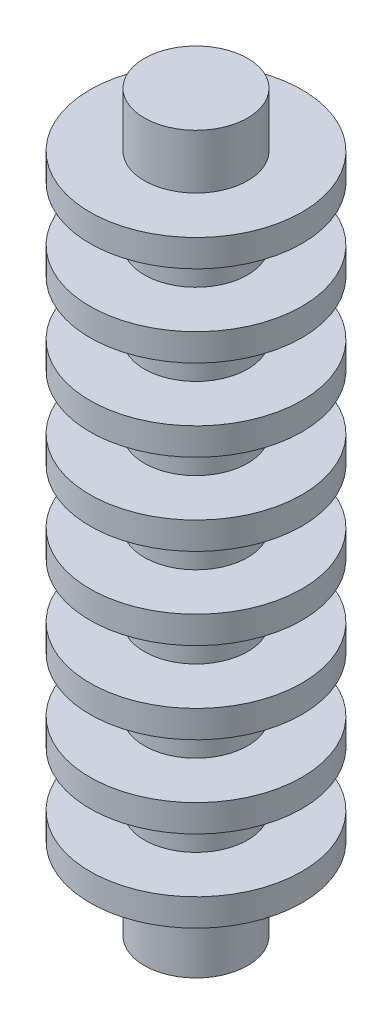
ISO-10303-21;
HEADER;
FILE_DESCRIPTION(('STEP AP214'),'2;1');
FILE_NAME('part.step','',(''),(''),'','','');
FILE_SCHEMA(('AUTOMOTIVE_DESIGN { 1 0 10303 214 1 1 1 1 }'));
ENDSEC;
DATA;
#1=APPLICATION_CONTEXT('core data for automotive mechanical design processes');
#2=APPLICATION_PROTOCOL_DEFINITION('international standard','automotive_design',2000,#1);
#3=PRODUCT_CONTEXT('',#1,'mechanical');
#4=PRODUCT('Part','Part','',(#3));
#5=PRODUCT_RELATED_PRODUCT_CATEGORY('part','',(#4));
#6=PRODUCT_DEFINITION_FORMATION('','',#4);
#7=PRODUCT_DEFINITION_CONTEXT('part definition',#1,'design');
#8=PRODUCT_DEFINITION('design','',#6,#7);
#9=PRODUCT_DEFINITION_SHAPE('','',#8);
#10=(LENGTH_UNIT() NAMED_UNIT(*) SI_UNIT(.MILLI.,.METRE.));
#11=(NAMED_UNIT(*) PLANE_ANGLE_UNIT() SI_UNIT($,.RADIAN.));
#12=(NAMED_UNIT(*) SI_UNIT($,.STERADIAN.) SOLID_ANGLE_UNIT());
#13=UNCERTAINTY_MEASURE_WITH_UNIT(LENGTH_MEASURE(1.E-05),#10,'distance_accuracy_value','');
#14=(GEOMETRIC_REPRESENTATION_CONTEXT(3) GLOBAL_UNCERTAINTY_ASSIGNED_CONTEXT((#13)) GLOBAL_UNIT_ASSIGNED_CONTEXT((#10,
#11,#12)) REPRESENTATION_CONTEXT('',''));
#15=CARTESIAN_POINT('',(0.,0.,0.));
#16=DIRECTION('',(0.,0.,1.));
#17=DIRECTION('',(1.,0.,0.));
#18=AXIS2_PLACEMENT_3D('',#15,#16,#17);
#19=CARTESIAN_POINT('',(3.8,27.,0.));
#20=DIRECTION('',(0.,-1.,0.));
#21=DIRECTION('',(1.,0.,0.));
#22=AXIS2_PLACEMENT_3D('',#19,#20,#21);
#23=PLANE('',#22);
#24=CARTESIAN_POINT('',(0.,27.,0.));
#25=DIRECTION('',(0.,1.,0.));
#26=DIRECTION('',(-1.,0.,0.));
#27=AXIS2_PLACEMENT_3D('',#24,#25,#26);
#28=CIRCLE('',#27,3.79999999999999);
#29=CARTESIAN_POINT('',(-3.79999999999998,27.,0.));
#30=VERTEX_POINT('',#29);
#31=EDGE_CURVE('E10',#30,#30,#28,.T.);
#32=ORIENTED_EDGE('',*,*,#31,.T.);
#33=EDGE_LOOP('',(#32));
#34=FACE_BOUND('',#33,.T.);
#35=ADVANCED_FACE('F40',(#34),#23,.F.);
#36=CARTESIAN_POINT('',(0.,27.,0.));
#37=DIRECTION('',(0.,1.,0.));
#38=DIRECTION('',(-1.,0.,0.));
#39=AXIS2_PLACEMENT_3D('',#36,#37,#38);
#40=CYLINDRICAL_SURFACE('',#39,3.79999999999999);
#41=ORIENTED_EDGE('',*,*,#31,.F.);
#42=EDGE_LOOP('',(#41));
#43=FACE_BOUND('',#42,.T.);
#44=CARTESIAN_POINT('',(0.,23.,0.));
#45=DIRECTION('',(0.,1.,0.));
#46=DIRECTION('',(-1.,0.,0.));
#47=AXIS2_PLACEMENT_3D('',#44,#45,#46);
#48=CIRCLE('',#47,3.79999999999999);
#49=CARTESIAN_POINT('',(-3.79999999999998,23.,0.));
#50=VERTEX_POINT('',#49);
#51=EDGE_CURVE('E46',#50,#50,#48,.T.);
#52=ORIENTED_EDGE('',*,*,#51,.T.);
#53=EDGE_LOOP('',(#52));
#54=FACE_BOUND('',#53,.T.);
#55=ADVANCED_FACE('F162',(#43,#54),#40,.T.);
#56=CARTESIAN_POINT('',(3.8,23.,0.));
#57=DIRECTION('',(0.,-1.,0.));
#58=DIRECTION('',(1.,0.,0.));
#59=AXIS2_PLACEMENT_3D('',#56,#57,#58);
#60=PLANE('',#59);
#61=ORIENTED_EDGE('',*,*,#51,.F.);
#62=EDGE_LOOP('',(#61));
#63=FACE_BOUND('',#62,.T.);
#64=CARTESIAN_POINT('',(0.,23.,0.));
#65=DIRECTION('',(0.,1.,0.));
#66=DIRECTION('',(-1.,0.,0.));
#67=AXIS2_PLACEMENT_3D('',#64,#65,#66);
#68=CIRCLE('',#67,7.8);
#69=CARTESIAN_POINT('',(-7.79999999999999,23.,0.));
#70=VERTEX_POINT('',#69);
#71=EDGE_CURVE('E50',#70,#70,#68,.T.);
#72=ORIENTED_EDGE('',*,*,#71,.T.);
#73=EDGE_LOOP('',(#72));
#74=FACE_BOUND('',#73,.T.);
#75=ADVANCED_FACE('F166',(#63,#74),#60,.F.);
#76=CARTESIAN_POINT('',(0.,27.,0.));
#77=DIRECTION('',(0.,1.,0.));
#78=DIRECTION('',(-1.,0.,0.));
#79=AXIS2_PLACEMENT_3D('',#76,#77,#78);
#80=CYLINDRICAL_SURFACE('',#79,7.79999999999999);
#81=ORIENTED_EDGE('',*,*,#71,.F.);
#82=EDGE_LOOP('',(#81));
#83=FACE_BOUND('',#82,.T.);
#84=CARTESIAN_POINT('',(0.,21.,0.));
#85=DIRECTION('',(0.,1.,0.));
#86=DIRECTION('',(-1.,0.,0.));
#87=AXIS2_PLACEMENT_3D('',#84,#85,#86);
#88=CIRCLE('',#87,7.79999999999999);
#89=CARTESIAN_POINT('',(-7.79999999999998,21.,0.));
#90=VERTEX_POINT('',#89);
#91=EDGE_CURVE('E54',#90,#90,#88,.T.);
#92=ORIENTED_EDGE('',*,*,#91,.T.);
#93=EDGE_LOOP('',(#92));
#94=FACE_BOUND('',#93,.T.);
#95=ADVANCED_FACE('F171',(#83,#94),#80,.T.);
#96=CARTESIAN_POINT('',(7.8,21.,0.));
#97=DIRECTION('',(0.,1.,0.));
#98=DIRECTION('',(-1.,0.,0.));
#99=AXIS2_PLACEMENT_3D('',#96,#97,#98);
#100=PLANE('',#99);
#101=ORIENTED_EDGE('',*,*,#91,.F.);
#102=EDGE_LOOP('',(#101));
#103=FACE_BOUND('',#102,.T.);
#104=CARTESIAN_POINT('',(0.,21.,0.));
#105=DIRECTION('',(0.,1.,0.));
#106=DIRECTION('',(-1.,0.,0.));
#107=AXIS2_PLACEMENT_3D('',#104,#105,#106);
#108=CIRCLE('',#107,3.79999999999999);
#109=CARTESIAN_POINT('',(-3.79999999999998,21.,0.));
#110=VERTEX_POINT('',#109);
#111=EDGE_CURVE('E59',#110,#110,#108,.T.);
#112=ORIENTED_EDGE('',*,*,#111,.T.);
#113=EDGE_LOOP('',(#112));
#114=FACE_BOUND('',#113,.T.);
#115=ADVANCED_FACE('F177',(#103,#114),#100,.F.);
#116=CARTESIAN_POINT('',(0.,27.,0.));
#117=DIRECTION('',(0.,1.,0.));
#118=DIRECTION('',(-1.,0.,0.));
#119=AXIS2_PLACEMENT_3D('',#116,#117,#118);
#120=CYLINDRICAL_SURFACE('',#119,3.79999999999981);
#121=ORIENTED_EDGE('',*,*,#111,.F.);
#122=EDGE_LOOP('',(#121));
#123=FACE_BOUND('',#122,.T.);
#124=CARTESIAN_POINT('',(0.,17.,0.));
#125=DIRECTION('',(0.,1.,0.));
#126=DIRECTION('',(-1.,0.,0.));
#127=AXIS2_PLACEMENT_3D('',#124,#125,#126);
#128=CIRCLE('',#127,3.80000000000005);
#129=CARTESIAN_POINT('',(-3.80000000000005,17.,0.));
#130=VERTEX_POINT('',#129);
#131=EDGE_CURVE('E62',#130,#130,#128,.T.);
#132=ORIENTED_EDGE('',*,*,#131,.T.);
#133=EDGE_LOOP('',(#132));
#134=FACE_BOUND('',#133,.T.);
#135=ADVANCED_FACE('F181',(#123,#134),#120,.T.);
#136=CARTESIAN_POINT('',(3.80000000000006,17.,0.));
#137=DIRECTION('',(0.,-1.,0.));
#138=DIRECTION('',(1.,0.,0.));
#139=AXIS2_PLACEMENT_3D('',#136,#137,#138);
#140=PLANE('',#139);
#141=ORIENTED_EDGE('',*,*,#131,.F.);
#142=EDGE_LOOP('',(#141));
#143=FACE_BOUND('',#142,.T.);
#144=CARTESIAN_POINT('',(0.,17.,0.));
#145=DIRECTION('',(0.,1.,0.));
#146=DIRECTION('',(-1.,0.,0.));
#147=AXIS2_PLACEMENT_3D('',#144,#145,#146);
#148=CIRCLE('',#147,7.80000000000006);
#149=CARTESIAN_POINT('',(-7.80000000000005,17.,0.));
#150=VERTEX_POINT('',#149);
#151=EDGE_CURVE('E65',#150,#150,#148,.T.);
#152=ORIENTED_EDGE('',*,*,#151,.T.);
#153=EDGE_LOOP('',(#152));
#154=FACE_BOUND('',#153,.T.);
#155=ADVANCED_FACE('F185',(#143,#154),#140,.F.);
#156=CARTESIAN_POINT('',(0.,27.,0.));
#157=DIRECTION('',(0.,1.,0.));
#158=DIRECTION('',(-1.,0.,0.));
#159=AXIS2_PLACEMENT_3D('',#156,#157,#158);
#160=CYLINDRICAL_SURFACE('',#159,7.80000000000006);
#161=ORIENTED_EDGE('',*,*,#151,.F.);
#162=EDGE_LOOP('',(#161));
#163=FACE_BOUND('',#162,.T.);
#164=CARTESIAN_POINT('',(0.,15.,0.));
#165=DIRECTION('',(0.,1.,0.));
#166=DIRECTION('',(-1.,0.,0.));
#167=AXIS2_PLACEMENT_3D('',#164,#165,#166);
#168=CIRCLE('',#167,7.80000000000006);
#169=CARTESIAN_POINT('',(-7.80000000000005,15.,0.));
#170=VERTEX_POINT('',#169);
#171=EDGE_CURVE('E68',#170,#170,#168,.T.);
#172=ORIENTED_EDGE('',*,*,#171,.T.);
#173=EDGE_LOOP('',(#172));
#174=FACE_BOUND('',#173,.T.);
#175=ADVANCED_FACE('F189',(#163,#174),#160,.T.);
#176=CARTESIAN_POINT('',(7.80000000000007,15.,0.));
#177=DIRECTION('',(0.,1.,0.));
#178=DIRECTION('',(-1.,0.,0.));
#179=AXIS2_PLACEMENT_3D('',#176,#177,#178);
#180=PLANE('',#179);
#181=ORIENTED_EDGE('',*,*,#171,.F.);
#182=EDGE_LOOP('',(#181));
#183=FACE_BOUND('',#182,.T.);
#184=CARTESIAN_POINT('',(0.,15.,0.));
#185=DIRECTION('',(0.,1.,0.));
#186=DIRECTION('',(-1.,0.,0.));
#187=AXIS2_PLACEMENT_3D('',#184,#185,#186);
#188=CIRCLE('',#187,3.80000000000005);
#189=CARTESIAN_POINT('',(-3.80000000000005,15.,0.));
#190=VERTEX_POINT('',#189);
#191=EDGE_CURVE('E71',#190,#190,#188,.T.);
#192=ORIENTED_EDGE('',*,*,#191,.T.);
#193=EDGE_LOOP('',(#192));
#194=FACE_BOUND('',#193,.T.);
#195=ADVANCED_FACE('F193',(#183,#194),#180,.F.);
#196=CARTESIAN_POINT('',(0.,27.,0.));
#197=DIRECTION('',(0.,1.,0.));
#198=DIRECTION('',(-1.,0.,0.));
#199=AXIS2_PLACEMENT_3D('',#196,#197,#198);
#200=CYLINDRICAL_SURFACE('',#199,3.80000000000012);
#201=ORIENTED_EDGE('',*,*,#191,.F.);
#202=EDGE_LOOP('',(#201));
#203=FACE_BOUND('',#202,.T.);
#204=CARTESIAN_POINT('',(0.,11.,0.));
#205=DIRECTION('',(0.,1.,0.));
#206=DIRECTION('',(-1.,0.,0.));
#207=AXIS2_PLACEMENT_3D('',#204,#205,#206);
#208=CIRCLE('',#207,3.80000000000012);
#209=CARTESIAN_POINT('',(-3.80000000000011,11.,0.));
#210=VERTEX_POINT('',#209);
#211=EDGE_CURVE('E74',#210,#210,#208,.T.);
#212=ORIENTED_EDGE('',*,*,#211,.T.);
#213=EDGE_LOOP('',(#212));
#214=FACE_BOUND('',#213,.T.);
#215=ADVANCED_FACE('F197',(#203,#214),#200,.T.);
#216=CARTESIAN_POINT('',(3.80000000000013,11.,0.));
#217=DIRECTION('',(0.,-1.,0.));
#218=DIRECTION('',(1.,0.,0.));
#219=AXIS2_PLACEMENT_3D('',#216,#217,#218);
#220=PLANE('',#219);
#221=ORIENTED_EDGE('',*,*,#211,.F.);
#222=EDGE_LOOP('',(#221));
#223=FACE_BOUND('',#222,.T.);
#224=CARTESIAN_POINT('',(0.,11.,0.));
#225=DIRECTION('',(0.,1.,0.));
#226=DIRECTION('',(-1.,0.,0.));
#227=AXIS2_PLACEMENT_3D('',#224,#225,#226);
#228=CIRCLE('',#227,7.80000000000012);
#229=CARTESIAN_POINT('',(-7.80000000000011,11.,0.));
#230=VERTEX_POINT('',#229);
#231=EDGE_CURVE('E77',#230,#230,#228,.T.);
#232=ORIENTED_EDGE('',*,*,#231,.T.);
#233=EDGE_LOOP('',(#232));
#234=FACE_BOUND('',#233,.T.);
#235=ADVANCED_FACE('F201',(#223,#234),#220,.F.);
#236=CARTESIAN_POINT('',(0.,27.,0.));
#237=DIRECTION('',(0.,1.,0.));
#238=DIRECTION('',(-1.,0.,0.));
#239=AXIS2_PLACEMENT_3D('',#236,#237,#238);
#240=CYLINDRICAL_SURFACE('',#239,7.80000000000012);
#241=ORIENTED_EDGE('',*,*,#231,.F.);
#242=EDGE_LOOP('',(#241));
#243=FACE_BOUND('',#242,.T.);
#244=CARTESIAN_POINT('',(0.,9.,0.));
#245=DIRECTION('',(0.,1.,0.));
#246=DIRECTION('',(-1.,0.,0.));
#247=AXIS2_PLACEMENT_3D('',#244,#245,#246);
#248=CIRCLE('',#247,7.80000000000012);
#249=CARTESIAN_POINT('',(-7.80000000000011,9.,0.));
#250=VERTEX_POINT('',#249);
#251=EDGE_CURVE('E80',#250,#250,#248,.T.);
#252=ORIENTED_EDGE('',*,*,#251,.T.);
#253=EDGE_LOOP('',(#252));
#254=FACE_BOUND('',#253,.T.);
#255=ADVANCED_FACE('F205',(#243,#254),#240,.T.);
#256=CARTESIAN_POINT('',(7.80000000000013,9.,0.));
#257=DIRECTION('',(0.,1.,0.));
#258=DIRECTION('',(-1.,0.,0.));
#259=AXIS2_PLACEMENT_3D('',#256,#257,#258);
#260=PLANE('',#259);
#261=ORIENTED_EDGE('',*,*,#251,.F.);
#262=EDGE_LOOP('',(#261));
#263=FACE_BOUND('',#262,.T.);
#264=CARTESIAN_POINT('',(0.,8.99999999999999,0.));
#265=DIRECTION('',(0.,1.,0.));
#266=DIRECTION('',(-1.,0.,0.));
#267=AXIS2_PLACEMENT_3D('',#264,#265,#266);
#268=CIRCLE('',#267,3.80000000000012);
#269=CARTESIAN_POINT('',(-3.80000000000011,8.99999999999999,0.));
#270=VERTEX_POINT('',#269);
#271=EDGE_CURVE('E83',#270,#270,#268,.T.);
#272=ORIENTED_EDGE('',*,*,#271,.T.);
#273=EDGE_LOOP('',(#272));
#274=FACE_BOUND('',#273,.T.);
#275=ADVANCED_FACE('F209',(#263,#274),#260,.F.);
#276=CARTESIAN_POINT('',(0.,27.,0.));
#277=DIRECTION('',(0.,1.,0.));
#278=DIRECTION('',(-1.,0.,0.));
#279=AXIS2_PLACEMENT_3D('',#276,#277,#278);
#280=CYLINDRICAL_SURFACE('',#279,3.80000000000018);
#281=ORIENTED_EDGE('',*,*,#271,.F.);
#282=EDGE_LOOP('',(#281));
#283=FACE_BOUND('',#282,.T.);
#284=CARTESIAN_POINT('',(0.,5.,0.));
#285=DIRECTION('',(0.,1.,0.));
#286=DIRECTION('',(-1.,0.,0.));
#287=AXIS2_PLACEMENT_3D('',#284,#285,#286);
#288=CIRCLE('',#287,3.80000000000018);
#289=CARTESIAN_POINT('',(-3.80000000000017,5.,0.));
#290=VERTEX_POINT('',#289);
#291=EDGE_CURVE('E86',#290,#290,#288,.T.);
#292=ORIENTED_EDGE('',*,*,#291,.T.);
#293=EDGE_LOOP('',(#292));
#294=FACE_BOUND('',#293,.T.);
#295=ADVANCED_FACE('F213',(#283,#294),#280,.T.);
#296=CARTESIAN_POINT('',(3.80000000000019,5.,0.));
#297=DIRECTION('',(0.,-1.,0.));
#298=DIRECTION('',(1.,0.,0.));
#299=AXIS2_PLACEMENT_3D('',#296,#297,#298);
#300=PLANE('',#299);
#301=ORIENTED_EDGE('',*,*,#291,.F.);
#302=EDGE_LOOP('',(#301));
#303=FACE_BOUND('',#302,.T.);
#304=CARTESIAN_POINT('',(0.,5.,0.));
#305=DIRECTION('',(0.,1.,0.));
#306=DIRECTION('',(-1.,0.,0.));
#307=AXIS2_PLACEMENT_3D('',#304,#305,#306);
#308=CIRCLE('',#307,7.80000000000018);
#309=CARTESIAN_POINT('',(-7.80000000000018,5.,0.));
#310=VERTEX_POINT('',#309);
#311=EDGE_CURVE('E89',#310,#310,#308,.T.);
#312=ORIENTED_EDGE('',*,*,#311,.T.);
#313=EDGE_LOOP('',(#312));
#314=FACE_BOUND('',#313,.T.);
#315=ADVANCED_FACE('F217',(#303,#314),#300,.F.);
#316=CARTESIAN_POINT('',(0.,27.,0.));
#317=DIRECTION('',(0.,1.,0.));
#318=DIRECTION('',(-1.,0.,0.));
#319=AXIS2_PLACEMENT_3D('',#316,#317,#318);
#320=CYLINDRICAL_SURFACE('',#319,7.80000000000018);
#321=ORIENTED_EDGE('',*,*,#311,.F.);
#322=EDGE_LOOP('',(#321));
#323=FACE_BOUND('',#322,.T.);
#324=CARTESIAN_POINT('',(0.,3.,0.));
#325=DIRECTION('',(0.,1.,0.));
#326=DIRECTION('',(-1.,0.,0.));
#327=AXIS2_PLACEMENT_3D('',#324,#325,#326);
#328=CIRCLE('',#327,7.80000000000018);
#329=CARTESIAN_POINT('',(-7.80000000000018,3.,0.));
#330=VERTEX_POINT('',#329);
#331=EDGE_CURVE('E92',#330,#330,#328,.T.);
#332=ORIENTED_EDGE('',*,*,#331,.T.);
#333=EDGE_LOOP('',(#332));
#334=FACE_BOUND('',#333,.T.);
#335=ADVANCED_FACE('F221',(#323,#334),#320,.T.);
#336=CARTESIAN_POINT('',(7.80000000000019,3.,0.));
#337=DIRECTION('',(0.,1.,0.));
#338=DIRECTION('',(-1.,0.,0.));
#339=AXIS2_PLACEMENT_3D('',#336,#337,#338);
#340=PLANE('',#339);
#341=ORIENTED_EDGE('',*,*,#331,.F.);
#342=EDGE_LOOP('',(#341));
#343=FACE_BOUND('',#342,.T.);
#344=CARTESIAN_POINT('',(0.,3.,0.));
#345=DIRECTION('',(0.,1.,0.));
#346=DIRECTION('',(-1.,0.,0.));
#347=AXIS2_PLACEMENT_3D('',#344,#345,#346);
#348=CIRCLE('',#347,3.80000000000018);
#349=CARTESIAN_POINT('',(-3.80000000000017,3.,0.));
#350=VERTEX_POINT('',#349);
#351=EDGE_CURVE('E95',#350,#350,#348,.T.);
#352=ORIENTED_EDGE('',*,*,#351,.T.);
#353=EDGE_LOOP('',(#352));
#354=FACE_BOUND('',#353,.T.);
#355=ADVANCED_FACE('F225',(#343,#354),#340,.F.);
#356=CARTESIAN_POINT('',(0.,27.,0.));
#357=DIRECTION('',(0.,1.,0.));
#358=DIRECTION('',(-1.,0.,0.));
#359=AXIS2_PLACEMENT_3D('',#356,#357,#358);
#360=CYLINDRICAL_SURFACE('',#359,3.80000000000024);
#361=ORIENTED_EDGE('',*,*,#351,.F.);
#362=EDGE_LOOP('',(#361));
#363=FACE_BOUND('',#362,.T.);
#364=CARTESIAN_POINT('',(0.,-1.,0.));
#365=DIRECTION('',(0.,1.,0.));
#366=DIRECTION('',(-1.,0.,0.));
#367=AXIS2_PLACEMENT_3D('',#364,#365,#366);
#368=CIRCLE('',#367,3.80000000000024);
#369=CARTESIAN_POINT('',(-3.80000000000024,-1.,0.));
#370=VERTEX_POINT('',#369);
#371=EDGE_CURVE('E98',#370,#370,#368,.T.);
#372=ORIENTED_EDGE('',*,*,#371,.T.);
#373=EDGE_LOOP('',(#372));
#374=FACE_BOUND('',#373,.T.);
#375=ADVANCED_FACE('F229',(#363,#374),#360,.T.);
#376=CARTESIAN_POINT('',(3.80000000000025,-1.,0.));
#377=DIRECTION('',(0.,-1.,0.));
#378=DIRECTION('',(1.,0.,0.));
#379=AXIS2_PLACEMENT_3D('',#376,#377,#378);
#380=PLANE('',#379);
#381=ORIENTED_EDGE('',*,*,#371,.F.);
#382=EDGE_LOOP('',(#381));
#383=FACE_BOUND('',#382,.T.);
#384=CARTESIAN_POINT('',(0.,-1.,0.));
#385=DIRECTION('',(0.,1.,0.));
#386=DIRECTION('',(-1.,0.,0.));
#387=AXIS2_PLACEMENT_3D('',#384,#385,#386);
#388=CIRCLE('',#387,7.80000000000025);
#389=CARTESIAN_POINT('',(-7.80000000000024,-1.,0.));
#390=VERTEX_POINT('',#389);
#391=EDGE_CURVE('E101',#390,#390,#388,.T.);
#392=ORIENTED_EDGE('',*,*,#391,.T.);
#393=EDGE_LOOP('',(#392));
#394=FACE_BOUND('',#393,.T.);
#395=ADVANCED_FACE('F233',(#383,#394),#380,.F.);
#396=CARTESIAN_POINT('',(0.,27.,0.));
#397=DIRECTION('',(0.,1.,0.));
#398=DIRECTION('',(-1.,0.,0.));
#399=AXIS2_PLACEMENT_3D('',#396,#397,#398);
#400=CYLINDRICAL_SURFACE('',#399,7.80000000000025);
#401=ORIENTED_EDGE('',*,*,#391,.F.);
#402=EDGE_LOOP('',(#401));
#403=FACE_BOUND('',#402,.T.);
#404=CARTESIAN_POINT('',(0.,-3.,0.));
#405=DIRECTION('',(0.,1.,0.));
#406=DIRECTION('',(-1.,0.,0.));
#407=AXIS2_PLACEMENT_3D('',#404,#405,#406);
#408=CIRCLE('',#407,7.80000000000025);
#409=CARTESIAN_POINT('',(-7.80000000000024,-3.,0.));
#410=VERTEX_POINT('',#409);
#411=EDGE_CURVE('E104',#410,#410,#408,.T.);
#412=ORIENTED_EDGE('',*,*,#411,.T.);
#413=EDGE_LOOP('',(#412));
#414=FACE_BOUND('',#413,.T.);
#415=ADVANCED_FACE('F237',(#403,#414),#400,.T.);
#416=CARTESIAN_POINT('',(7.80000000000025,-3.,0.));
#417=DIRECTION('',(0.,1.,0.));
#418=DIRECTION('',(-1.,0.,0.));
#419=AXIS2_PLACEMENT_3D('',#416,#417,#418);
#420=PLANE('',#419);
#421=ORIENTED_EDGE('',*,*,#411,.F.);
#422=EDGE_LOOP('',(#421));
#423=FACE_BOUND('',#422,.T.);
#424=CARTESIAN_POINT('',(0.,-3.,0.));
#425=DIRECTION('',(0.,1.,0.));
#426=DIRECTION('',(-1.,0.,0.));
#427=AXIS2_PLACEMENT_3D('',#424,#425,#426);
#428=CIRCLE('',#427,3.80000000000024);
#429=CARTESIAN_POINT('',(-3.80000000000024,-3.,0.));
#430=VERTEX_POINT('',#429);
#431=EDGE_CURVE('E107',#430,#430,#428,.T.);
#432=ORIENTED_EDGE('',*,*,#431,.T.);
#433=EDGE_LOOP('',(#432));
#434=FACE_BOUND('',#433,.T.);
#435=ADVANCED_FACE('F241',(#423,#434),#420,.F.);
#436=CARTESIAN_POINT('',(0.,27.,0.));
#437=DIRECTION('',(0.,1.,0.));
#438=DIRECTION('',(-1.,0.,0.));
#439=AXIS2_PLACEMENT_3D('',#436,#437,#438);
#440=CYLINDRICAL_SURFACE('',#439,3.80000000000031);
#441=ORIENTED_EDGE('',*,*,#431,.F.);
#442=EDGE_LOOP('',(#441));
#443=FACE_BOUND('',#442,.T.);
#444=CARTESIAN_POINT('',(0.,-7.,0.));
#445=DIRECTION('',(0.,1.,0.));
#446=DIRECTION('',(-1.,0.,0.));
#447=AXIS2_PLACEMENT_3D('',#444,#445,#446);
#448=CIRCLE('',#447,3.80000000000031);
#449=CARTESIAN_POINT('',(-3.8000000000003,-6.99999999999999,0.));
#450=VERTEX_POINT('',#449);
#451=EDGE_CURVE('E110',#450,#450,#448,.T.);
#452=ORIENTED_EDGE('',*,*,#451,.T.);
#453=EDGE_LOOP('',(#452));
#454=FACE_BOUND('',#453,.T.);
#455=ADVANCED_FACE('F245',(#443,#454),#440,.T.);
#456=CARTESIAN_POINT('',(3.80000000000031,-7.,0.));
#457=DIRECTION('',(0.,-1.,0.));
#458=DIRECTION('',(1.,0.,0.));
#459=AXIS2_PLACEMENT_3D('',#456,#457,#458);
#460=PLANE('',#459);
#461=ORIENTED_EDGE('',*,*,#451,.F.);
#462=EDGE_LOOP('',(#461));
#463=FACE_BOUND('',#462,.T.);
#464=CARTESIAN_POINT('',(0.,-7.,0.));
#465=DIRECTION('',(0.,1.,0.));
#466=DIRECTION('',(-1.,0.,0.));
#467=AXIS2_PLACEMENT_3D('',#464,#465,#466);
#468=CIRCLE('',#467,7.80000000000031);
#469=CARTESIAN_POINT('',(-7.80000000000031,-6.99999999999999,0.));
#470=VERTEX_POINT('',#469);
#471=EDGE_CURVE('E113',#470,#470,#468,.T.);
#472=ORIENTED_EDGE('',*,*,#471,.T.);
#473=EDGE_LOOP('',(#472));
#474=FACE_BOUND('',#473,.T.);
#475=ADVANCED_FACE('F249',(#463,#474),#460,.F.);
#476=CARTESIAN_POINT('',(0.,27.,0.));
#477=DIRECTION('',(0.,1.,0.));
#478=DIRECTION('',(-1.,0.,0.));
#479=AXIS2_PLACEMENT_3D('',#476,#477,#478);
#480=CYLINDRICAL_SURFACE('',#479,7.80000000000031);
#481=ORIENTED_EDGE('',*,*,#471,.F.);
#482=EDGE_LOOP('',(#481));
#483=FACE_BOUND('',#482,.T.);
#484=CARTESIAN_POINT('',(0.,-9.,0.));
#485=DIRECTION('',(0.,1.,0.));
#486=DIRECTION('',(-1.,0.,0.));
#487=AXIS2_PLACEMENT_3D('',#484,#485,#486);
#488=CIRCLE('',#487,7.80000000000031);
#489=CARTESIAN_POINT('',(-7.80000000000031,-9.,0.));
#490=VERTEX_POINT('',#489);
#491=EDGE_CURVE('E116',#490,#490,#488,.T.);
#492=ORIENTED_EDGE('',*,*,#491,.T.);
#493=EDGE_LOOP('',(#492));
#494=FACE_BOUND('',#493,.T.);
#495=ADVANCED_FACE('F253',(#483,#494),#480,.T.);
#496=CARTESIAN_POINT('',(7.80000000000032,-9.,0.));
#497=DIRECTION('',(0.,1.,0.));
#498=DIRECTION('',(-1.,0.,0.));
#499=AXIS2_PLACEMENT_3D('',#496,#497,#498);
#500=PLANE('',#499);
#501=ORIENTED_EDGE('',*,*,#491,.F.);
#502=EDGE_LOOP('',(#501));
#503=FACE_BOUND('',#502,.T.);
#504=CARTESIAN_POINT('',(0.,-9.,0.));
#505=DIRECTION('',(0.,1.,0.));
#506=DIRECTION('',(-1.,0.,0.));
#507=AXIS2_PLACEMENT_3D('',#504,#505,#506);
#508=CIRCLE('',#507,3.80000000000031);
#509=CARTESIAN_POINT('',(-3.8000000000003,-9.,0.));
#510=VERTEX_POINT('',#509);
#511=EDGE_CURVE('E119',#510,#510,#508,.T.);
#512=ORIENTED_EDGE('',*,*,#511,.T.);
#513=EDGE_LOOP('',(#512));
#514=FACE_BOUND('',#513,.T.);
#515=ADVANCED_FACE('F257',(#503,#514),#500,.F.);
#516=CARTESIAN_POINT('',(0.,27.,0.));
#517=DIRECTION('',(0.,1.,0.));
#518=DIRECTION('',(-1.,0.,0.));
#519=AXIS2_PLACEMENT_3D('',#516,#517,#518);
#520=CYLINDRICAL_SURFACE('',#519,3.80000000000037);
#521=ORIENTED_EDGE('',*,*,#511,.F.);
#522=EDGE_LOOP('',(#521));
#523=FACE_BOUND('',#522,.T.);
#524=CARTESIAN_POINT('',(0.,-13.,0.));
#525=DIRECTION('',(0.,1.,0.));
#526=DIRECTION('',(-1.,0.,0.));
#527=AXIS2_PLACEMENT_3D('',#524,#525,#526);
#528=CIRCLE('',#527,3.80000000000037);
#529=CARTESIAN_POINT('',(-3.80000000000037,-13.,0.));
#530=VERTEX_POINT('',#529);
#531=EDGE_CURVE('E122',#530,#530,#528,.T.);
#532=ORIENTED_EDGE('',*,*,#531,.T.);
#533=EDGE_LOOP('',(#532));
#534=FACE_BOUND('',#533,.T.);
#535=ADVANCED_FACE('F261',(#523,#534),#520,.T.);
#536=CARTESIAN_POINT('',(3.80000000000038,-13.,0.));
#537=DIRECTION('',(0.,-1.,0.));
#538=DIRECTION('',(1.,0.,0.));
#539=AXIS2_PLACEMENT_3D('',#536,#537,#538);
#540=PLANE('',#539);
#541=ORIENTED_EDGE('',*,*,#531,.F.);
#542=EDGE_LOOP('',(#541));
#543=FACE_BOUND('',#542,.T.);
#544=CARTESIAN_POINT('',(0.,-13.,0.));
#545=DIRECTION('',(0.,1.,0.));
#546=DIRECTION('',(-1.,0.,0.));
#547=AXIS2_PLACEMENT_3D('',#544,#545,#546);
#548=CIRCLE('',#547,7.80000000000037);
#549=CARTESIAN_POINT('',(-7.80000000000037,-13.,0.));
#550=VERTEX_POINT('',#549);
#551=EDGE_CURVE('E125',#550,#550,#548,.T.);
#552=ORIENTED_EDGE('',*,*,#551,.T.);
#553=EDGE_LOOP('',(#552));
#554=FACE_BOUND('',#553,.T.);
#555=ADVANCED_FACE('F265',(#543,#554),#540,.F.);
#556=CARTESIAN_POINT('',(0.,27.,0.));
#557=DIRECTION('',(0.,1.,0.));
#558=DIRECTION('',(-1.,0.,0.));
#559=AXIS2_PLACEMENT_3D('',#556,#557,#558);
#560=CYLINDRICAL_SURFACE('',#559,7.80000000000037);
#561=ORIENTED_EDGE('',*,*,#551,.F.);
#562=EDGE_LOOP('',(#561));
#563=FACE_BOUND('',#562,.T.);
#564=CARTESIAN_POINT('',(0.,-15.,0.));
#565=DIRECTION('',(0.,1.,0.));
#566=DIRECTION('',(-1.,0.,0.));
#567=AXIS2_PLACEMENT_3D('',#564,#565,#566);
#568=CIRCLE('',#567,7.80000000000037);
#569=CARTESIAN_POINT('',(-7.80000000000037,-15.,0.));
#570=VERTEX_POINT('',#569);
#571=EDGE_CURVE('E128',#570,#570,#568,.T.);
#572=ORIENTED_EDGE('',*,*,#571,.T.);
#573=EDGE_LOOP('',(#572));
#574=FACE_BOUND('',#573,.T.);
#575=ADVANCED_FACE('F269',(#563,#574),#560,.T.);
#576=CARTESIAN_POINT('',(7.80000000000038,-15.,0.));
#577=DIRECTION('',(0.,1.,0.));
#578=DIRECTION('',(-1.,0.,0.));
#579=AXIS2_PLACEMENT_3D('',#576,#577,#578);
#580=PLANE('',#579);
#581=ORIENTED_EDGE('',*,*,#571,.F.);
#582=EDGE_LOOP('',(#581));
#583=FACE_BOUND('',#582,.T.);
#584=CARTESIAN_POINT('',(0.,-15.,0.));
#585=DIRECTION('',(0.,1.,0.));
#586=DIRECTION('',(-1.,0.,0.));
#587=AXIS2_PLACEMENT_3D('',#584,#585,#586);
#588=CIRCLE('',#587,3.80000000000037);
#589=CARTESIAN_POINT('',(-3.80000000000037,-15.,0.));
#590=VERTEX_POINT('',#589);
#591=EDGE_CURVE('E131',#590,#590,#588,.T.);
#592=ORIENTED_EDGE('',*,*,#591,.T.);
#593=EDGE_LOOP('',(#592));
#594=FACE_BOUND('',#593,.T.);
#595=ADVANCED_FACE('F273',(#583,#594),#580,.F.);
#596=CARTESIAN_POINT('',(0.,27.,0.));
#597=DIRECTION('',(0.,1.,0.));
#598=DIRECTION('',(-1.,0.,0.));
#599=AXIS2_PLACEMENT_3D('',#596,#597,#598);
#600=CYLINDRICAL_SURFACE('',#599,3.80000000000043);
#601=ORIENTED_EDGE('',*,*,#591,.F.);
#602=EDGE_LOOP('',(#601));
#603=FACE_BOUND('',#602,.T.);
#604=CARTESIAN_POINT('',(0.,-19.,0.));
#605=DIRECTION('',(0.,1.,0.));
#606=DIRECTION('',(-1.,0.,0.));
#607=AXIS2_PLACEMENT_3D('',#604,#605,#606);
#608=CIRCLE('',#607,3.80000000000043);
#609=CARTESIAN_POINT('',(-3.80000000000043,-19.,0.));
#610=VERTEX_POINT('',#609);
#611=EDGE_CURVE('E134',#610,#610,#608,.T.);
#612=ORIENTED_EDGE('',*,*,#611,.T.);
#613=EDGE_LOOP('',(#612));
#614=FACE_BOUND('',#613,.T.);
#615=ADVANCED_FACE('F277',(#603,#614),#600,.T.);
#616=CARTESIAN_POINT('',(3.80000000000044,-19.,0.));
#617=DIRECTION('',(0.,-1.,0.));
#618=DIRECTION('',(1.,0.,0.));
#619=AXIS2_PLACEMENT_3D('',#616,#617,#618);
#620=PLANE('',#619);
#621=ORIENTED_EDGE('',*,*,#611,.F.);
#622=EDGE_LOOP('',(#621));
#623=FACE_BOUND('',#622,.T.);
#624=CARTESIAN_POINT('',(0.,-19.,0.));
#625=DIRECTION('',(0.,1.,0.));
#626=DIRECTION('',(-1.,0.,0.));
#627=AXIS2_PLACEMENT_3D('',#624,#625,#626);
#628=CIRCLE('',#627,7.80000000000044);
#629=CARTESIAN_POINT('',(-7.80000000000043,-19.,0.));
#630=VERTEX_POINT('',#629);
#631=EDGE_CURVE('E137',#630,#630,#628,.T.);
#632=ORIENTED_EDGE('',*,*,#631,.T.);
#633=EDGE_LOOP('',(#632));
#634=FACE_BOUND('',#633,.T.);
#635=ADVANCED_FACE('F281',(#623,#634),#620,.F.);
#636=CARTESIAN_POINT('',(0.,27.,0.));
#637=DIRECTION('',(0.,1.,0.));
#638=DIRECTION('',(-1.,0.,0.));
#639=AXIS2_PLACEMENT_3D('',#636,#637,#638);
#640=CYLINDRICAL_SURFACE('',#639,7.80000000000044);
#641=ORIENTED_EDGE('',*,*,#631,.F.);
#642=EDGE_LOOP('',(#641));
#643=FACE_BOUND('',#642,.T.);
#644=CARTESIAN_POINT('',(0.,-21.,0.));
#645=DIRECTION('',(0.,1.,0.));
#646=DIRECTION('',(-1.,0.,0.));
#647=AXIS2_PLACEMENT_3D('',#644,#645,#646);
#648=CIRCLE('',#647,7.80000000000044);
#649=CARTESIAN_POINT('',(-7.80000000000043,-21.,0.));
#650=VERTEX_POINT('',#649);
#651=EDGE_CURVE('E140',#650,#650,#648,.T.);
#652=ORIENTED_EDGE('',*,*,#651,.T.);
#653=EDGE_LOOP('',(#652));
#654=FACE_BOUND('',#653,.T.);
#655=ADVANCED_FACE('F285',(#643,#654),#640,.T.);
#656=CARTESIAN_POINT('',(7.80000000000044,-21.,0.));
#657=DIRECTION('',(0.,1.,0.));
#658=DIRECTION('',(-1.,0.,0.));
#659=AXIS2_PLACEMENT_3D('',#656,#657,#658);
#660=PLANE('',#659);
#661=ORIENTED_EDGE('',*,*,#651,.F.);
#662=EDGE_LOOP('',(#661));
#663=FACE_BOUND('',#662,.T.);
#664=CARTESIAN_POINT('',(0.,-21.,0.));
#665=DIRECTION('',(0.,1.,0.));
#666=DIRECTION('',(-1.,0.,0.));
#667=AXIS2_PLACEMENT_3D('',#664,#665,#666);
#668=CIRCLE('',#667,3.80000000000043);
#669=CARTESIAN_POINT('',(-3.80000000000043,-21.,0.));
#670=VERTEX_POINT('',#669);
#671=EDGE_CURVE('E143',#670,#670,#668,.T.);
#672=ORIENTED_EDGE('',*,*,#671,.T.);
#673=EDGE_LOOP('',(#672));
#674=FACE_BOUND('',#673,.T.);
#675=ADVANCED_FACE('F158',(#663,#674),#660,.F.);
#676=CARTESIAN_POINT('',(0.,27.,0.));
#677=DIRECTION('',(0.,1.,0.));
#678=DIRECTION('',(-1.,0.,0.));
#679=AXIS2_PLACEMENT_3D('',#676,#677,#678);
#680=CYLINDRICAL_SURFACE('',#679,3.8);
#681=ORIENTED_EDGE('',*,*,#671,.F.);
#682=EDGE_LOOP('',(#681));
#683=FACE_BOUND('',#682,.T.);
#684=CARTESIAN_POINT('',(0.,-27.,0.));
#685=DIRECTION('',(0.,1.,0.));
#686=DIRECTION('',(-1.,0.,0.));
#687=AXIS2_PLACEMENT_3D('',#684,#685,#686);
#688=CIRCLE('',#687,3.8);
#689=CARTESIAN_POINT('',(-3.8,-27.,0.));
#690=VERTEX_POINT('',#689);
#691=EDGE_CURVE('E146',#690,#690,#688,.T.);
#692=ORIENTED_EDGE('',*,*,#691,.T.);
#693=EDGE_LOOP('',(#692));
#694=FACE_BOUND('',#693,.T.);
#695=ADVANCED_FACE('F150',(#683,#694),#680,.T.);
#696=CARTESIAN_POINT('',(3.80000000000001,-27.,0.));
#697=DIRECTION('',(0.,1.,0.));
#698=DIRECTION('',(-1.,0.,0.));
#699=AXIS2_PLACEMENT_3D('',#696,#697,#698);
#700=PLANE('',#699);
#701=ORIENTED_EDGE('',*,*,#691,.F.);
#702=EDGE_LOOP('',(#701));
#703=FACE_BOUND('',#702,.T.);
#704=ADVANCED_FACE('F152',(#703),#700,.F.);
#705=CLOSED_SHELL('',(#35,#55,#75,#95,#115,#135,#155,#175,#195,#215,#235,#255,#275,#295,#315,
#335,#355,#375,#395,#415,#435,#455,#475,#495,#515,#535,#555,#575,#595,#615,#635,#655,#675,#695,#704));
#706=MANIFOLD_SOLID_BREP('B2',#705);
#707=ADVANCED_BREP_SHAPE_REPRESENTATION('',(#18,#706),#14);
#708=SHAPE_DEFINITION_REPRESENTATION(#9,#707);
ENDSEC;
END-ISO-10303-21;
